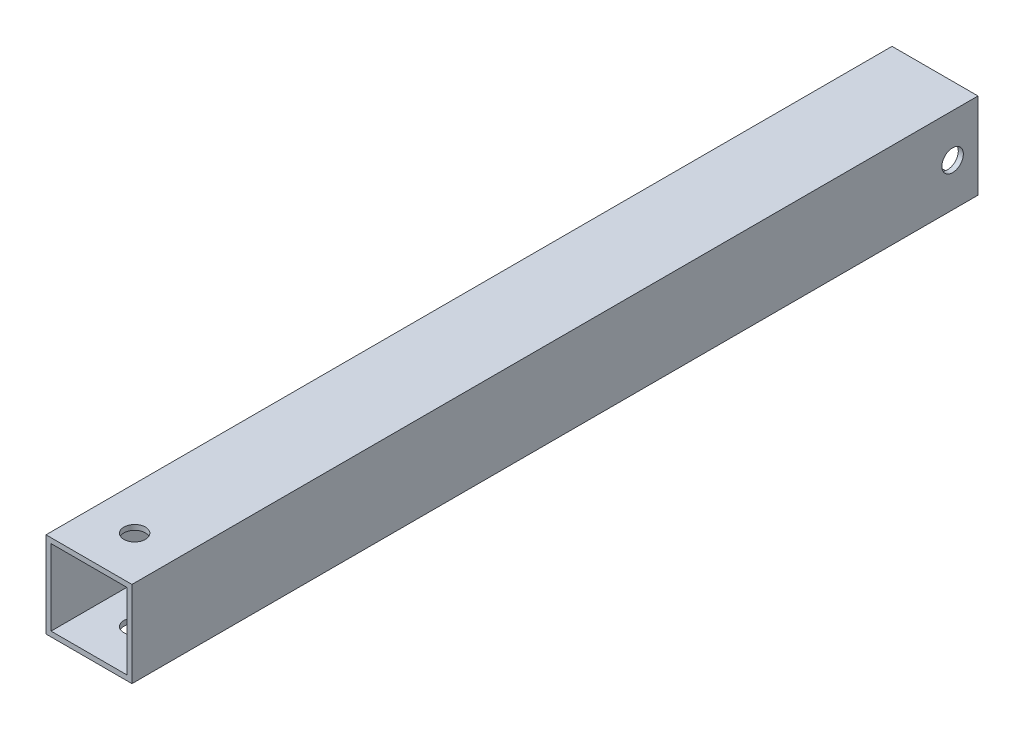
ISO-10303-21;
HEADER;
FILE_DESCRIPTION(('STEP AP214'),'2;1');
FILE_NAME('part.step','',(''),(''),'','','');
FILE_SCHEMA(('AUTOMOTIVE_DESIGN { 1 0 10303 214 1 1 1 1 }'));
ENDSEC;
DATA;
#1=APPLICATION_CONTEXT('core data for automotive mechanical design processes');
#2=APPLICATION_PROTOCOL_DEFINITION('international standard','automotive_design',2000,#1);
#3=PRODUCT_CONTEXT('',#1,'mechanical');
#4=PRODUCT('Part','Part','',(#3));
#5=PRODUCT_RELATED_PRODUCT_CATEGORY('part','',(#4));
#6=PRODUCT_DEFINITION_FORMATION('','',#4);
#7=PRODUCT_DEFINITION_CONTEXT('part definition',#1,'design');
#8=PRODUCT_DEFINITION('design','',#6,#7);
#9=PRODUCT_DEFINITION_SHAPE('','',#8);
#10=(LENGTH_UNIT() NAMED_UNIT(*) SI_UNIT(.MILLI.,.METRE.));
#11=(NAMED_UNIT(*) PLANE_ANGLE_UNIT() SI_UNIT($,.RADIAN.));
#12=(NAMED_UNIT(*) SI_UNIT($,.STERADIAN.) SOLID_ANGLE_UNIT());
#13=UNCERTAINTY_MEASURE_WITH_UNIT(LENGTH_MEASURE(1.E-05),#10,'distance_accuracy_value','');
#14=(GEOMETRIC_REPRESENTATION_CONTEXT(3) GLOBAL_UNCERTAINTY_ASSIGNED_CONTEXT((#13)) GLOBAL_UNIT_ASSIGNED_CONTEXT((#10,
#11,#12)) REPRESENTATION_CONTEXT('',''));
#15=CARTESIAN_POINT('',(0.,0.,0.));
#16=DIRECTION('',(0.,0.,1.));
#17=DIRECTION('',(1.,0.,0.));
#18=AXIS2_PLACEMENT_3D('',#15,#16,#17);
#19=CARTESIAN_POINT('',(0.,0.,250.));
#20=DIRECTION('',(0.,0.,-1.));
#21=DIRECTION('',(-1.,0.,0.));
#22=AXIS2_PLACEMENT_3D('',#19,#20,#21);
#23=PLANE('',#22);
#24=DIRECTION('',(0.,1.,0.));
#25=VECTOR('',#24,1.);
#26=CARTESIAN_POINT('',(25.4,-25.4,250.));
#27=LINE('',#26,#25);
#28=CARTESIAN_POINT('',(25.4,-25.4,250.));
#29=VERTEX_POINT('',#28);
#30=CARTESIAN_POINT('',(25.4,25.4,250.));
#31=VERTEX_POINT('',#30);
#32=EDGE_CURVE('E140',#29,#31,#27,.T.);
#33=ORIENTED_EDGE('',*,*,#32,.T.);
#34=DIRECTION('',(-1.,0.,0.));
#35=VECTOR('',#34,1.);
#36=CARTESIAN_POINT('',(-25.4,25.4,250.));
#37=LINE('',#36,#35);
#38=CARTESIAN_POINT('',(-25.4,25.4,250.));
#39=VERTEX_POINT('',#38);
#40=EDGE_CURVE('E143',#31,#39,#37,.T.);
#41=ORIENTED_EDGE('',*,*,#40,.T.);
#42=DIRECTION('',(0.,-1.,0.));
#43=VECTOR('',#42,1.);
#44=CARTESIAN_POINT('',(-25.4,-25.4,250.));
#45=LINE('',#44,#43);
#46=CARTESIAN_POINT('',(-25.4,-25.4,250.));
#47=VERTEX_POINT('',#46);
#48=EDGE_CURVE('E146',#39,#47,#45,.T.);
#49=ORIENTED_EDGE('',*,*,#48,.T.);
#50=DIRECTION('',(1.,0.,0.));
#51=VECTOR('',#50,1.);
#52=CARTESIAN_POINT('',(-25.4,-25.4,250.));
#53=LINE('',#52,#51);
#54=EDGE_CURVE('E148',#47,#29,#53,.T.);
#55=ORIENTED_EDGE('',*,*,#54,.T.);
#56=EDGE_LOOP('',(#33,#41,#49,#55));
#57=FACE_BOUND('',#56,.T.);
#58=DIRECTION('',(0.,-1.,0.));
#59=VECTOR('',#58,1.);
#60=CARTESIAN_POINT('',(-22.4,-22.4,250.));
#61=LINE('',#60,#59);
#62=CARTESIAN_POINT('',(-22.4,22.4,250.));
#63=VERTEX_POINT('',#62);
#64=CARTESIAN_POINT('',(-22.4,-22.4,250.));
#65=VERTEX_POINT('',#64);
#66=EDGE_CURVE('E102',#63,#65,#61,.T.);
#67=ORIENTED_EDGE('',*,*,#66,.F.);
#68=DIRECTION('',(-1.,0.,0.));
#69=VECTOR('',#68,1.);
#70=CARTESIAN_POINT('',(-22.4,22.4,250.));
#71=LINE('',#70,#69);
#72=CARTESIAN_POINT('',(22.4,22.4,250.));
#73=VERTEX_POINT('',#72);
#74=EDGE_CURVE('E124',#73,#63,#71,.T.);
#75=ORIENTED_EDGE('',*,*,#74,.F.);
#76=DIRECTION('',(0.,1.,0.));
#77=VECTOR('',#76,1.);
#78=CARTESIAN_POINT('',(22.4,-22.4,250.));
#79=LINE('',#78,#77);
#80=CARTESIAN_POINT('',(22.4,-22.4,250.));
#81=VERTEX_POINT('',#80);
#82=EDGE_CURVE('E122',#81,#73,#79,.T.);
#83=ORIENTED_EDGE('',*,*,#82,.F.);
#84=DIRECTION('',(1.,0.,0.));
#85=VECTOR('',#84,1.);
#86=CARTESIAN_POINT('',(-22.4,-22.4,250.));
#87=LINE('',#86,#85);
#88=EDGE_CURVE('E110',#65,#81,#87,.T.);
#89=ORIENTED_EDGE('',*,*,#88,.F.);
#90=EDGE_LOOP('',(#67,#75,#83,#89));
#91=FACE_BOUND('',#90,.T.);
#92=ADVANCED_FACE('F35',(#57,#91),#23,.F.);
#93=CARTESIAN_POINT('',(0.,0.,-250.));
#94=DIRECTION('',(0.,0.,-1.));
#95=DIRECTION('',(-1.,0.,0.));
#96=AXIS2_PLACEMENT_3D('',#93,#94,#95);
#97=PLANE('',#96);
#98=DIRECTION('',(0.,1.,0.));
#99=VECTOR('',#98,1.);
#100=CARTESIAN_POINT('',(25.4,-25.4,-250.));
#101=LINE('',#100,#99);
#102=CARTESIAN_POINT('',(25.4,-25.4,-250.));
#103=VERTEX_POINT('',#102);
#104=CARTESIAN_POINT('',(25.4,25.4,-250.));
#105=VERTEX_POINT('',#104);
#106=EDGE_CURVE('E118',#103,#105,#101,.T.);
#107=ORIENTED_EDGE('',*,*,#106,.F.);
#108=DIRECTION('',(1.,0.,0.));
#109=VECTOR('',#108,1.);
#110=CARTESIAN_POINT('',(-25.4,-25.4,-250.));
#111=LINE('',#110,#109);
#112=CARTESIAN_POINT('',(-25.4,-25.4,-250.));
#113=VERTEX_POINT('',#112);
#114=EDGE_CURVE('E144',#113,#103,#111,.T.);
#115=ORIENTED_EDGE('',*,*,#114,.F.);
#116=DIRECTION('',(0.,-1.,0.));
#117=VECTOR('',#116,1.);
#118=CARTESIAN_POINT('',(-25.4,-25.4,-250.));
#119=LINE('',#118,#117);
#120=CARTESIAN_POINT('',(-25.4,25.4,-250.));
#121=VERTEX_POINT('',#120);
#122=EDGE_CURVE('E155',#121,#113,#119,.T.);
#123=ORIENTED_EDGE('',*,*,#122,.F.);
#124=DIRECTION('',(-1.,0.,0.));
#125=VECTOR('',#124,1.);
#126=CARTESIAN_POINT('',(-25.4,25.4,-250.));
#127=LINE('',#126,#125);
#128=EDGE_CURVE('E153',#105,#121,#127,.T.);
#129=ORIENTED_EDGE('',*,*,#128,.F.);
#130=EDGE_LOOP('',(#107,#115,#123,#129));
#131=FACE_BOUND('',#130,.T.);
#132=DIRECTION('',(-1.,0.,0.));
#133=VECTOR('',#132,1.);
#134=CARTESIAN_POINT('',(-22.4,22.4,-250.));
#135=LINE('',#134,#133);
#136=CARTESIAN_POINT('',(22.4,22.4,-250.));
#137=VERTEX_POINT('',#136);
#138=CARTESIAN_POINT('',(-22.4,22.4,-250.));
#139=VERTEX_POINT('',#138);
#140=EDGE_CURVE('E111',#137,#139,#135,.T.);
#141=ORIENTED_EDGE('',*,*,#140,.T.);
#142=DIRECTION('',(0.,-1.,0.));
#143=VECTOR('',#142,1.);
#144=CARTESIAN_POINT('',(-22.4,-22.4,-250.));
#145=LINE('',#144,#143);
#146=CARTESIAN_POINT('',(-22.4,-22.4,-250.));
#147=VERTEX_POINT('',#146);
#148=EDGE_CURVE('E60',#139,#147,#145,.T.);
#149=ORIENTED_EDGE('',*,*,#148,.T.);
#150=DIRECTION('',(1.,0.,0.));
#151=VECTOR('',#150,1.);
#152=CARTESIAN_POINT('',(-22.4,-22.4,-250.));
#153=LINE('',#152,#151);
#154=CARTESIAN_POINT('',(22.4,-22.4,-250.));
#155=VERTEX_POINT('',#154);
#156=EDGE_CURVE('E117',#147,#155,#153,.T.);
#157=ORIENTED_EDGE('',*,*,#156,.T.);
#158=DIRECTION('',(0.,1.,0.));
#159=VECTOR('',#158,1.);
#160=CARTESIAN_POINT('',(22.4,-22.4,-250.));
#161=LINE('',#160,#159);
#162=EDGE_CURVE('E132',#155,#137,#161,.T.);
#163=ORIENTED_EDGE('',*,*,#162,.T.);
#164=EDGE_LOOP('',(#141,#149,#157,#163));
#165=FACE_BOUND('',#164,.T.);
#166=ADVANCED_FACE('F200',(#131,#165),#97,.T.);
#167=CARTESIAN_POINT('',(25.4,-25.4,250.));
#168=DIRECTION('',(-1.,0.,0.));
#169=DIRECTION('',(0.,0.,1.));
#170=AXIS2_PLACEMENT_3D('',#167,#168,#169);
#171=PLANE('',#170);
#172=CARTESIAN_POINT('',(25.4,0.,-235.));
#173=DIRECTION('',(1.,0.,0.));
#174=DIRECTION('',(0.,0.,1.));
#175=AXIS2_PLACEMENT_3D('',#172,#173,#174);
#176=CIRCLE('',#175,6.35);
#177=CARTESIAN_POINT('',(25.4,0.,-228.65));
#178=VERTEX_POINT('',#177);
#179=EDGE_CURVE('E171',#178,#178,#176,.T.);
#180=ORIENTED_EDGE('',*,*,#179,.F.);
#181=EDGE_LOOP('',(#180));
#182=FACE_BOUND('',#181,.T.);
#183=ORIENTED_EDGE('',*,*,#106,.T.);
#184=DIRECTION('',(0.,0.,-1.));
#185=VECTOR('',#184,1.);
#186=CARTESIAN_POINT('',(25.4,25.4,250.));
#187=LINE('',#186,#185);
#188=EDGE_CURVE('E11',#31,#105,#187,.T.);
#189=ORIENTED_EDGE('',*,*,#188,.F.);
#190=ORIENTED_EDGE('',*,*,#32,.F.);
#191=DIRECTION('',(0.,0.,-1.));
#192=VECTOR('',#191,1.);
#193=CARTESIAN_POINT('',(25.4,-25.4,250.));
#194=LINE('',#193,#192);
#195=EDGE_CURVE('E150',#29,#103,#194,.T.);
#196=ORIENTED_EDGE('',*,*,#195,.T.);
#197=EDGE_LOOP('',(#183,#189,#190,#196));
#198=FACE_BOUND('',#197,.T.);
#199=ADVANCED_FACE('F37',(#182,#198),#171,.F.);
#200=CARTESIAN_POINT('',(-25.4,25.4,250.));
#201=DIRECTION('',(0.,-1.,0.));
#202=DIRECTION('',(0.,0.,-1.));
#203=AXIS2_PLACEMENT_3D('',#200,#201,#202);
#204=PLANE('',#203);
#205=CARTESIAN_POINT('',(0.,25.4,223.));
#206=DIRECTION('',(0.,1.,0.));
#207=DIRECTION('',(0.,0.,1.));
#208=AXIS2_PLACEMENT_3D('',#205,#206,#207);
#209=CIRCLE('',#208,6.35);
#210=CARTESIAN_POINT('',(0.,25.4,229.35));
#211=VERTEX_POINT('',#210);
#212=EDGE_CURVE('E184',#211,#211,#209,.T.);
#213=ORIENTED_EDGE('',*,*,#212,.F.);
#214=EDGE_LOOP('',(#213));
#215=FACE_BOUND('',#214,.T.);
#216=ORIENTED_EDGE('',*,*,#128,.T.);
#217=DIRECTION('',(0.,0.,-1.));
#218=VECTOR('',#217,1.);
#219=CARTESIAN_POINT('',(-25.4,25.4,250.));
#220=LINE('',#219,#218);
#221=EDGE_CURVE('E44',#39,#121,#220,.T.);
#222=ORIENTED_EDGE('',*,*,#221,.F.);
#223=ORIENTED_EDGE('',*,*,#40,.F.);
#224=ORIENTED_EDGE('',*,*,#188,.T.);
#225=EDGE_LOOP('',(#216,#222,#223,#224));
#226=FACE_BOUND('',#225,.T.);
#227=ADVANCED_FACE('F226',(#215,#226),#204,.F.);
#228=CARTESIAN_POINT('',(-25.4,-25.4,250.));
#229=DIRECTION('',(1.,0.,0.));
#230=DIRECTION('',(0.,0.,-1.));
#231=AXIS2_PLACEMENT_3D('',#228,#229,#230);
#232=PLANE('',#231);
#233=CARTESIAN_POINT('',(-25.4,0.,-235.));
#234=DIRECTION('',(1.,0.,0.));
#235=DIRECTION('',(0.,0.,1.));
#236=AXIS2_PLACEMENT_3D('',#233,#234,#235);
#237=CIRCLE('',#236,6.35);
#238=CARTESIAN_POINT('',(-25.4,0.,-228.65));
#239=VERTEX_POINT('',#238);
#240=EDGE_CURVE('E166',#239,#239,#237,.T.);
#241=ORIENTED_EDGE('',*,*,#240,.T.);
#242=EDGE_LOOP('',(#241));
#243=FACE_BOUND('',#242,.T.);
#244=ORIENTED_EDGE('',*,*,#122,.T.);
#245=DIRECTION('',(0.,0.,-1.));
#246=VECTOR('',#245,1.);
#247=CARTESIAN_POINT('',(-25.4,-25.4,250.));
#248=LINE('',#247,#246);
#249=EDGE_CURVE('E160',#47,#113,#248,.T.);
#250=ORIENTED_EDGE('',*,*,#249,.F.);
#251=ORIENTED_EDGE('',*,*,#48,.F.);
#252=ORIENTED_EDGE('',*,*,#221,.T.);
#253=EDGE_LOOP('',(#244,#250,#251,#252));
#254=FACE_BOUND('',#253,.T.);
#255=ADVANCED_FACE('F223',(#243,#254),#232,.F.);
#256=CARTESIAN_POINT('',(-25.4,-25.4,250.));
#257=DIRECTION('',(0.,1.,0.));
#258=DIRECTION('',(0.,0.,1.));
#259=AXIS2_PLACEMENT_3D('',#256,#257,#258);
#260=PLANE('',#259);
#261=CARTESIAN_POINT('',(0.,-25.4,223.));
#262=DIRECTION('',(0.,1.,0.));
#263=DIRECTION('',(0.,0.,1.));
#264=AXIS2_PLACEMENT_3D('',#261,#262,#263);
#265=CIRCLE('',#264,6.35);
#266=CARTESIAN_POINT('',(0.,-25.4,229.35));
#267=VERTEX_POINT('',#266);
#268=EDGE_CURVE('E176',#267,#267,#265,.T.);
#269=ORIENTED_EDGE('',*,*,#268,.T.);
#270=EDGE_LOOP('',(#269));
#271=FACE_BOUND('',#270,.T.);
#272=ORIENTED_EDGE('',*,*,#114,.T.);
#273=ORIENTED_EDGE('',*,*,#195,.F.);
#274=ORIENTED_EDGE('',*,*,#54,.F.);
#275=ORIENTED_EDGE('',*,*,#249,.T.);
#276=EDGE_LOOP('',(#272,#273,#274,#275));
#277=FACE_BOUND('',#276,.T.);
#278=ADVANCED_FACE('F220',(#271,#277),#260,.F.);
#279=CARTESIAN_POINT('',(-22.4,-22.4,250.));
#280=DIRECTION('',(1.,0.,0.));
#281=DIRECTION('',(0.,0.,-1.));
#282=AXIS2_PLACEMENT_3D('',#279,#280,#281);
#283=PLANE('',#282);
#284=CARTESIAN_POINT('',(-22.4,0.,-235.));
#285=DIRECTION('',(1.,0.,0.));
#286=DIRECTION('',(0.,0.,-1.));
#287=AXIS2_PLACEMENT_3D('',#284,#285,#286);
#288=CIRCLE('',#287,6.35);
#289=CARTESIAN_POINT('',(-22.4,0.,-241.35));
#290=VERTEX_POINT('',#289);
#291=EDGE_CURVE('E130',#290,#290,#288,.T.);
#292=ORIENTED_EDGE('',*,*,#291,.F.);
#293=EDGE_LOOP('',(#292));
#294=FACE_BOUND('',#293,.T.);
#295=ORIENTED_EDGE('',*,*,#148,.F.);
#296=DIRECTION('',(0.,0.,-1.));
#297=VECTOR('',#296,1.);
#298=CARTESIAN_POINT('',(-22.4,22.4,250.));
#299=LINE('',#298,#297);
#300=EDGE_CURVE('E106',#63,#139,#299,.T.);
#301=ORIENTED_EDGE('',*,*,#300,.F.);
#302=ORIENTED_EDGE('',*,*,#66,.T.);
#303=DIRECTION('',(0.,0.,-1.));
#304=VECTOR('',#303,1.);
#305=CARTESIAN_POINT('',(-22.4,-22.4,250.));
#306=LINE('',#305,#304);
#307=EDGE_CURVE('E105',#65,#147,#306,.T.);
#308=ORIENTED_EDGE('',*,*,#307,.T.);
#309=EDGE_LOOP('',(#295,#301,#302,#308));
#310=FACE_BOUND('',#309,.T.);
#311=ADVANCED_FACE('F104',(#294,#310),#283,.T.);
#312=CARTESIAN_POINT('',(-22.4,-22.4,250.));
#313=DIRECTION('',(0.,1.,0.));
#314=DIRECTION('',(0.,0.,1.));
#315=AXIS2_PLACEMENT_3D('',#312,#313,#314);
#316=PLANE('',#315);
#317=CARTESIAN_POINT('',(0.,-22.4,223.));
#318=DIRECTION('',(0.,1.,0.));
#319=DIRECTION('',(0.,0.,1.));
#320=AXIS2_PLACEMENT_3D('',#317,#318,#319);
#321=CIRCLE('',#320,6.35);
#322=CARTESIAN_POINT('',(0.,-22.4,229.35));
#323=VERTEX_POINT('',#322);
#324=EDGE_CURVE('E181',#323,#323,#321,.T.);
#325=ORIENTED_EDGE('',*,*,#324,.F.);
#326=EDGE_LOOP('',(#325));
#327=FACE_BOUND('',#326,.T.);
#328=ORIENTED_EDGE('',*,*,#156,.F.);
#329=ORIENTED_EDGE('',*,*,#307,.F.);
#330=ORIENTED_EDGE('',*,*,#88,.T.);
#331=DIRECTION('',(0.,0.,-1.));
#332=VECTOR('',#331,1.);
#333=CARTESIAN_POINT('',(22.4,-22.4,250.));
#334=LINE('',#333,#332);
#335=EDGE_CURVE('E119',#81,#155,#334,.T.);
#336=ORIENTED_EDGE('',*,*,#335,.T.);
#337=EDGE_LOOP('',(#328,#329,#330,#336));
#338=FACE_BOUND('',#337,.T.);
#339=ADVANCED_FACE('F114',(#327,#338),#316,.T.);
#340=CARTESIAN_POINT('',(22.4,-22.4,250.));
#341=DIRECTION('',(-1.,0.,0.));
#342=DIRECTION('',(0.,-1.,0.));
#343=AXIS2_PLACEMENT_3D('',#340,#341,#342);
#344=PLANE('',#343);
#345=CARTESIAN_POINT('',(22.4,0.,-235.));
#346=DIRECTION('',(-1.,0.,0.));
#347=DIRECTION('',(0.,-1.,0.));
#348=AXIS2_PLACEMENT_3D('',#345,#346,#347);
#349=CIRCLE('',#348,6.35);
#350=CARTESIAN_POINT('',(22.4,-6.35,-235.));
#351=VERTEX_POINT('',#350);
#352=EDGE_CURVE('E164',#351,#351,#349,.T.);
#353=ORIENTED_EDGE('',*,*,#352,.F.);
#354=EDGE_LOOP('',(#353));
#355=FACE_BOUND('',#354,.T.);
#356=ORIENTED_EDGE('',*,*,#162,.F.);
#357=ORIENTED_EDGE('',*,*,#335,.F.);
#358=ORIENTED_EDGE('',*,*,#82,.T.);
#359=DIRECTION('',(0.,0.,-1.));
#360=VECTOR('',#359,1.);
#361=CARTESIAN_POINT('',(22.4,22.4,250.));
#362=LINE('',#361,#360);
#363=EDGE_CURVE('E52',#73,#137,#362,.T.);
#364=ORIENTED_EDGE('',*,*,#363,.T.);
#365=EDGE_LOOP('',(#356,#357,#358,#364));
#366=FACE_BOUND('',#365,.T.);
#367=ADVANCED_FACE('F196',(#355,#366),#344,.T.);
#368=CARTESIAN_POINT('',(-22.4,22.4,250.));
#369=DIRECTION('',(0.,-1.,0.));
#370=DIRECTION('',(1.,0.,0.));
#371=AXIS2_PLACEMENT_3D('',#368,#369,#370);
#372=PLANE('',#371);
#373=CARTESIAN_POINT('',(0.,22.4,223.));
#374=DIRECTION('',(0.,-1.,0.));
#375=DIRECTION('',(1.,0.,0.));
#376=AXIS2_PLACEMENT_3D('',#373,#374,#375);
#377=CIRCLE('',#376,6.35);
#378=CARTESIAN_POINT('',(6.35,22.4,223.));
#379=VERTEX_POINT('',#378);
#380=EDGE_CURVE('E39',#379,#379,#377,.T.);
#381=ORIENTED_EDGE('',*,*,#380,.F.);
#382=EDGE_LOOP('',(#381));
#383=FACE_BOUND('',#382,.T.);
#384=ORIENTED_EDGE('',*,*,#140,.F.);
#385=ORIENTED_EDGE('',*,*,#363,.F.);
#386=ORIENTED_EDGE('',*,*,#74,.T.);
#387=ORIENTED_EDGE('',*,*,#300,.T.);
#388=EDGE_LOOP('',(#384,#385,#386,#387));
#389=FACE_BOUND('',#388,.T.);
#390=ADVANCED_FACE('F193',(#383,#389),#372,.T.);
#391=CARTESIAN_POINT('',(-25.4,0.,-235.));
#392=DIRECTION('',(1.,0.,0.));
#393=DIRECTION('',(0.,0.,-1.));
#394=AXIS2_PLACEMENT_3D('',#391,#392,#393);
#395=CYLINDRICAL_SURFACE('',#394,6.35);
#396=ORIENTED_EDGE('',*,*,#352,.T.);
#397=EDGE_LOOP('',(#396));
#398=FACE_BOUND('',#397,.T.);
#399=ORIENTED_EDGE('',*,*,#179,.T.);
#400=EDGE_LOOP('',(#399));
#401=FACE_BOUND('',#400,.T.);
#402=ADVANCED_FACE('F195',(#398,#401),#395,.F.);
#403=ORIENTED_EDGE('',*,*,#291,.T.);
#404=EDGE_LOOP('',(#403));
#405=FACE_BOUND('',#404,.T.);
#406=ORIENTED_EDGE('',*,*,#240,.F.);
#407=EDGE_LOOP('',(#406));
#408=FACE_BOUND('',#407,.T.);
#409=ADVANCED_FACE('F252',(#405,#408),#395,.F.);
#410=CARTESIAN_POINT('',(0.,-44.6,223.));
#411=DIRECTION('',(0.,1.,0.));
#412=DIRECTION('',(0.,0.,1.));
#413=AXIS2_PLACEMENT_3D('',#410,#411,#412);
#414=CYLINDRICAL_SURFACE('',#413,6.35);
#415=ORIENTED_EDGE('',*,*,#380,.T.);
#416=EDGE_LOOP('',(#415));
#417=FACE_BOUND('',#416,.T.);
#418=ORIENTED_EDGE('',*,*,#212,.T.);
#419=EDGE_LOOP('',(#418));
#420=FACE_BOUND('',#419,.T.);
#421=ADVANCED_FACE('F191',(#417,#420),#414,.F.);
#422=ORIENTED_EDGE('',*,*,#324,.T.);
#423=EDGE_LOOP('',(#422));
#424=FACE_BOUND('',#423,.T.);
#425=ORIENTED_EDGE('',*,*,#268,.F.);
#426=EDGE_LOOP('',(#425));
#427=FACE_BOUND('',#426,.T.);
#428=ADVANCED_FACE('F260',(#424,#427),#414,.F.);
#429=CLOSED_SHELL('',(#92,#166,#199,#227,#255,#278,#311,#339,#367,#390,#402,#409,#421,#428));
#430=MANIFOLD_SOLID_BREP('B2',#429);
#431=ADVANCED_BREP_SHAPE_REPRESENTATION('',(#18,#430),#14);
#432=SHAPE_DEFINITION_REPRESENTATION(#9,#431);
ENDSEC;
END-ISO-10303-21;
